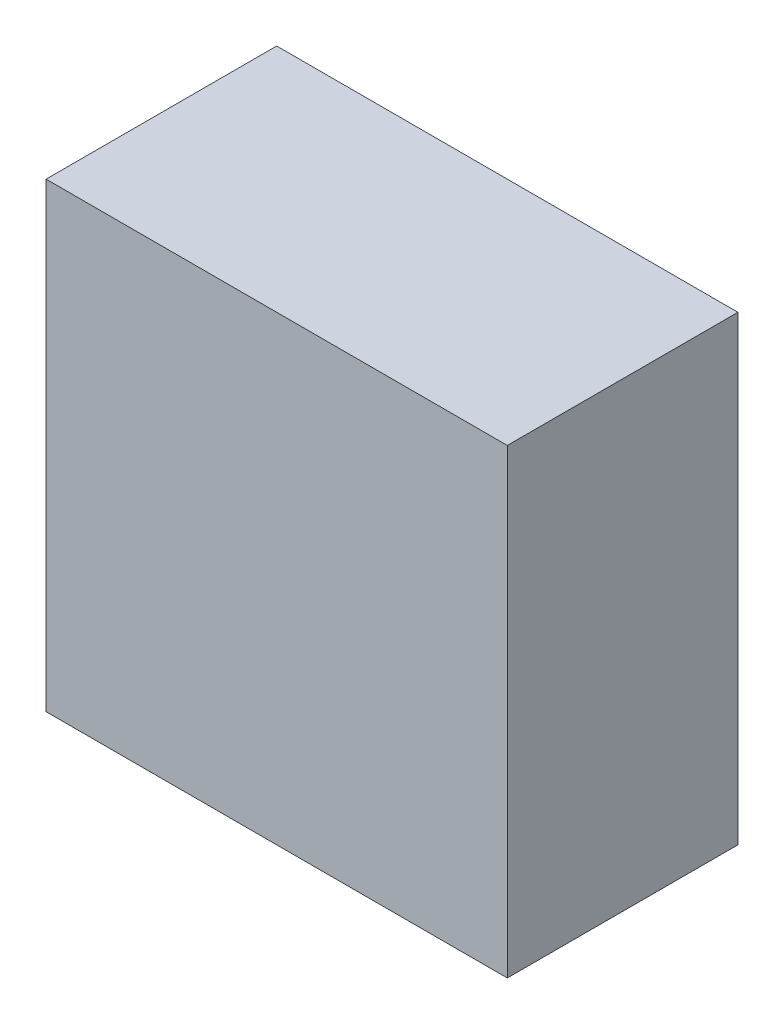
ISO-10303-21;
HEADER;
FILE_DESCRIPTION(('STEP AP214'),'2;1');
FILE_NAME('part.step','',(''),(''),'','','');
FILE_SCHEMA(('AUTOMOTIVE_DESIGN { 1 0 10303 214 1 1 1 1 }'));
ENDSEC;
DATA;
#1=APPLICATION_CONTEXT('core data for automotive mechanical design processes');
#2=APPLICATION_PROTOCOL_DEFINITION('international standard','automotive_design',2000,#1);
#3=PRODUCT_CONTEXT('',#1,'mechanical');
#4=PRODUCT('Part','Part','',(#3));
#5=PRODUCT_RELATED_PRODUCT_CATEGORY('part','',(#4));
#6=PRODUCT_DEFINITION_FORMATION('','',#4);
#7=PRODUCT_DEFINITION_CONTEXT('part definition',#1,'design');
#8=PRODUCT_DEFINITION('design','',#6,#7);
#9=PRODUCT_DEFINITION_SHAPE('','',#8);
#10=(LENGTH_UNIT() NAMED_UNIT(*) SI_UNIT(.MILLI.,.METRE.));
#11=(NAMED_UNIT(*) PLANE_ANGLE_UNIT() SI_UNIT($,.RADIAN.));
#12=(NAMED_UNIT(*) SI_UNIT($,.STERADIAN.) SOLID_ANGLE_UNIT());
#13=UNCERTAINTY_MEASURE_WITH_UNIT(LENGTH_MEASURE(1.E-05),#10,'distance_accuracy_value','');
#14=(GEOMETRIC_REPRESENTATION_CONTEXT(3) GLOBAL_UNCERTAINTY_ASSIGNED_CONTEXT((#13)) GLOBAL_UNIT_ASSIGNED_CONTEXT((#10,
#11,#12)) REPRESENTATION_CONTEXT('',''));
#15=CARTESIAN_POINT('',(0.,0.,0.));
#16=DIRECTION('',(0.,0.,1.));
#17=DIRECTION('',(1.,0.,0.));
#18=AXIS2_PLACEMENT_3D('',#15,#16,#17);
#19=CARTESIAN_POINT('',(70.0447196422429,-13.0323357413141,10.));
#20=DIRECTION('',(-1.,0.,0.));
#21=DIRECTION('',(0.,0.,1.));
#22=AXIS2_PLACEMENT_3D('',#19,#20,#21);
#23=PLANE('',#22);
#24=DIRECTION('',(0.,1.,0.));
#25=VECTOR('',#24,1.);
#26=CARTESIAN_POINT('',(70.0447196422429,-13.0323357413141,0.));
#27=LINE('',#26,#25);
#28=CARTESIAN_POINT('',(70.0447196422429,-13.0323357413141,0.));
#29=VERTEX_POINT('',#28);
#30=CARTESIAN_POINT('',(70.0447196422429,6.9676642586859,0.));
#31=VERTEX_POINT('',#30);
#32=EDGE_CURVE('E75',#29,#31,#27,.T.);
#33=ORIENTED_EDGE('',*,*,#32,.T.);
#34=DIRECTION('',(0.,0.,-1.));
#35=VECTOR('',#34,1.);
#36=CARTESIAN_POINT('',(70.0447196422429,6.9676642586859,10.));
#37=LINE('',#36,#35);
#38=CARTESIAN_POINT('',(70.0447196422429,6.9676642586859,10.));
#39=VERTEX_POINT('',#38);
#40=EDGE_CURVE('E11',#39,#31,#37,.T.);
#41=ORIENTED_EDGE('',*,*,#40,.F.);
#42=DIRECTION('',(0.,1.,0.));
#43=VECTOR('',#42,1.);
#44=CARTESIAN_POINT('',(70.0447196422429,-13.0323357413141,10.));
#45=LINE('',#44,#43);
#46=CARTESIAN_POINT('',(70.0447196422429,-13.0323357413141,10.));
#47=VERTEX_POINT('',#46);
#48=EDGE_CURVE('E93',#47,#39,#45,.T.);
#49=ORIENTED_EDGE('',*,*,#48,.F.);
#50=DIRECTION('',(0.,0.,-1.));
#51=VECTOR('',#50,1.);
#52=CARTESIAN_POINT('',(70.0447196422429,-13.0323357413141,10.));
#53=LINE('',#52,#51);
#54=EDGE_CURVE('E87',#47,#29,#53,.T.);
#55=ORIENTED_EDGE('',*,*,#54,.T.);
#56=EDGE_LOOP('',(#33,#41,#49,#55));
#57=FACE_BOUND('',#56,.T.);
#58=ADVANCED_FACE('F31',(#57),#23,.F.);
#59=CARTESIAN_POINT('',(50.0447196422428,6.9676642586859,10.));
#60=DIRECTION('',(0.,-1.,0.));
#61=DIRECTION('',(1.,0.,0.));
#62=AXIS2_PLACEMENT_3D('',#59,#60,#61);
#63=PLANE('',#62);
#64=DIRECTION('',(-1.,0.,0.));
#65=VECTOR('',#64,1.);
#66=CARTESIAN_POINT('',(50.0447196422428,6.9676642586859,0.));
#67=LINE('',#66,#65);
#68=CARTESIAN_POINT('',(50.0447196422428,6.9676642586859,0.));
#69=VERTEX_POINT('',#68);
#70=EDGE_CURVE('E71',#31,#69,#67,.T.);
#71=ORIENTED_EDGE('',*,*,#70,.T.);
#72=DIRECTION('',(0.,0.,-1.));
#73=VECTOR('',#72,1.);
#74=CARTESIAN_POINT('',(50.0447196422428,6.9676642586859,10.));
#75=LINE('',#74,#73);
#76=CARTESIAN_POINT('',(50.0447196422428,6.9676642586859,10.));
#77=VERTEX_POINT('',#76);
#78=EDGE_CURVE('E38',#77,#69,#75,.T.);
#79=ORIENTED_EDGE('',*,*,#78,.F.);
#80=DIRECTION('',(-1.,0.,0.));
#81=VECTOR('',#80,1.);
#82=CARTESIAN_POINT('',(50.0447196422428,6.9676642586859,10.));
#83=LINE('',#82,#81);
#84=EDGE_CURVE('E83',#39,#77,#83,.T.);
#85=ORIENTED_EDGE('',*,*,#84,.F.);
#86=ORIENTED_EDGE('',*,*,#40,.T.);
#87=EDGE_LOOP('',(#71,#79,#85,#86));
#88=FACE_BOUND('',#87,.T.);
#89=ADVANCED_FACE('F82',(#88),#63,.F.);
#90=CARTESIAN_POINT('',(50.0447196422428,6.9676642586859,10.));
#91=DIRECTION('',(1.,0.,0.));
#92=DIRECTION('',(0.,0.,-1.));
#93=AXIS2_PLACEMENT_3D('',#90,#91,#92);
#94=PLANE('',#93);
#95=DIRECTION('',(0.,-1.,0.));
#96=VECTOR('',#95,1.);
#97=CARTESIAN_POINT('',(50.0447196422428,6.9676642586859,0.));
#98=LINE('',#97,#96);
#99=CARTESIAN_POINT('',(50.0447196422428,-13.0323357413141,0.));
#100=VERTEX_POINT('',#99);
#101=EDGE_CURVE('E76',#69,#100,#98,.T.);
#102=ORIENTED_EDGE('',*,*,#101,.T.);
#103=DIRECTION('',(0.,0.,-1.));
#104=VECTOR('',#103,1.);
#105=CARTESIAN_POINT('',(50.0447196422428,-13.0323357413141,10.));
#106=LINE('',#105,#104);
#107=CARTESIAN_POINT('',(50.0447196422428,-13.0323357413141,10.));
#108=VERTEX_POINT('',#107);
#109=EDGE_CURVE('E99',#108,#100,#106,.T.);
#110=ORIENTED_EDGE('',*,*,#109,.F.);
#111=DIRECTION('',(0.,-1.,0.));
#112=VECTOR('',#111,1.);
#113=CARTESIAN_POINT('',(50.0447196422428,6.9676642586859,10.));
#114=LINE('',#113,#112);
#115=EDGE_CURVE('E50',#77,#108,#114,.T.);
#116=ORIENTED_EDGE('',*,*,#115,.F.);
#117=ORIENTED_EDGE('',*,*,#78,.T.);
#118=EDGE_LOOP('',(#102,#110,#116,#117));
#119=FACE_BOUND('',#118,.T.);
#120=ADVANCED_FACE('F102',(#119),#94,.F.);
#121=CARTESIAN_POINT('',(50.0447196422428,-13.0323357413141,10.));
#122=DIRECTION('',(0.,1.,0.));
#123=DIRECTION('',(0.,0.,1.));
#124=AXIS2_PLACEMENT_3D('',#121,#122,#123);
#125=PLANE('',#124);
#126=DIRECTION('',(1.,0.,0.));
#127=VECTOR('',#126,1.);
#128=CARTESIAN_POINT('',(50.0447196422428,-13.0323357413141,0.));
#129=LINE('',#128,#127);
#130=EDGE_CURVE('E91',#100,#29,#129,.T.);
#131=ORIENTED_EDGE('',*,*,#130,.T.);
#132=ORIENTED_EDGE('',*,*,#54,.F.);
#133=DIRECTION('',(1.,0.,0.));
#134=VECTOR('',#133,1.);
#135=CARTESIAN_POINT('',(50.0447196422428,-13.0323357413141,10.));
#136=LINE('',#135,#134);
#137=EDGE_CURVE('E45',#108,#47,#136,.T.);
#138=ORIENTED_EDGE('',*,*,#137,.F.);
#139=ORIENTED_EDGE('',*,*,#109,.T.);
#140=EDGE_LOOP('',(#131,#132,#138,#139));
#141=FACE_BOUND('',#140,.T.);
#142=ADVANCED_FACE('F104',(#141),#125,.F.);
#143=CARTESIAN_POINT('',(70.0447196422429,-13.0323357413141,10.));
#144=DIRECTION('',(0.,0.,-1.));
#145=DIRECTION('',(-1.,0.,0.));
#146=AXIS2_PLACEMENT_3D('',#143,#144,#145);
#147=PLANE('',#146);
#148=ORIENTED_EDGE('',*,*,#48,.T.);
#149=ORIENTED_EDGE('',*,*,#84,.T.);
#150=ORIENTED_EDGE('',*,*,#115,.T.);
#151=ORIENTED_EDGE('',*,*,#137,.T.);
#152=EDGE_LOOP('',(#148,#149,#150,#151));
#153=FACE_BOUND('',#152,.T.);
#154=ADVANCED_FACE('F105',(#153),#147,.F.);
#155=CARTESIAN_POINT('',(70.0447196422429,-13.0323357413141,0.));
#156=DIRECTION('',(0.,0.,-1.));
#157=DIRECTION('',(-1.,0.,0.));
#158=AXIS2_PLACEMENT_3D('',#155,#156,#157);
#159=PLANE('',#158);
#160=ORIENTED_EDGE('',*,*,#32,.F.);
#161=ORIENTED_EDGE('',*,*,#130,.F.);
#162=ORIENTED_EDGE('',*,*,#101,.F.);
#163=ORIENTED_EDGE('',*,*,#70,.F.);
#164=EDGE_LOOP('',(#160,#161,#162,#163));
#165=FACE_BOUND('',#164,.T.);
#166=ADVANCED_FACE('F72',(#165),#159,.T.);
#167=CLOSED_SHELL('',(#58,#89,#120,#142,#154,#166));
#168=MANIFOLD_SOLID_BREP('B2',#167);
#169=ADVANCED_BREP_SHAPE_REPRESENTATION('',(#18,#168),#14);
#170=SHAPE_DEFINITION_REPRESENTATION(#9,#169);
ENDSEC;
END-ISO-10303-21;
